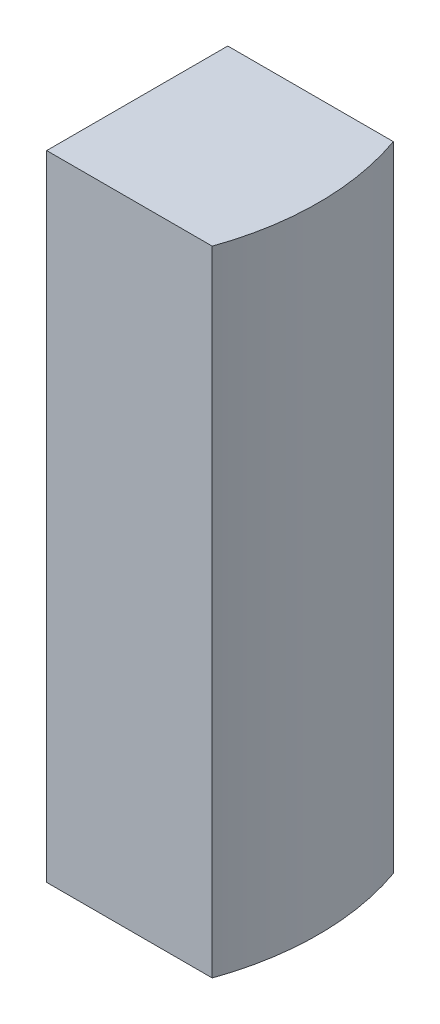
ISO-10303-21;
HEADER;
FILE_DESCRIPTION(('STEP AP214'),'2;1');
FILE_NAME('part.step','',(''),(''),'','','');
FILE_SCHEMA(('AUTOMOTIVE_DESIGN { 1 0 10303 214 1 1 1 1 }'));
ENDSEC;
DATA;
#1=APPLICATION_CONTEXT('core data for automotive mechanical design processes');
#2=APPLICATION_PROTOCOL_DEFINITION('international standard','automotive_design',2000,#1);
#3=PRODUCT_CONTEXT('',#1,'mechanical');
#4=PRODUCT('Part','Part','',(#3));
#5=PRODUCT_RELATED_PRODUCT_CATEGORY('part','',(#4));
#6=PRODUCT_DEFINITION_FORMATION('','',#4);
#7=PRODUCT_DEFINITION_CONTEXT('part definition',#1,'design');
#8=PRODUCT_DEFINITION('design','',#6,#7);
#9=PRODUCT_DEFINITION_SHAPE('','',#8);
#10=(LENGTH_UNIT() NAMED_UNIT(*) SI_UNIT(.MILLI.,.METRE.));
#11=(NAMED_UNIT(*) PLANE_ANGLE_UNIT() SI_UNIT($,.RADIAN.));
#12=(NAMED_UNIT(*) SI_UNIT($,.STERADIAN.) SOLID_ANGLE_UNIT());
#13=UNCERTAINTY_MEASURE_WITH_UNIT(LENGTH_MEASURE(1.E-05),#10,'distance_accuracy_value','');
#14=(GEOMETRIC_REPRESENTATION_CONTEXT(3) GLOBAL_UNCERTAINTY_ASSIGNED_CONTEXT((#13)) GLOBAL_UNIT_ASSIGNED_CONTEXT((#10,
#11,#12)) REPRESENTATION_CONTEXT('',''));
#15=CARTESIAN_POINT('',(0.,0.,0.));
#16=DIRECTION('',(0.,0.,1.));
#17=DIRECTION('',(1.,0.,0.));
#18=AXIS2_PLACEMENT_3D('',#15,#16,#17);
#19=CARTESIAN_POINT('',(0.,140.,20.));
#20=DIRECTION('',(0.,0.,-1.));
#21=DIRECTION('',(-1.,0.,0.));
#22=AXIS2_PLACEMENT_3D('',#19,#20,#21);
#23=PLANE('',#22);
#24=DIRECTION('',(1.,0.,0.));
#25=VECTOR('',#24,1.);
#26=CARTESIAN_POINT('',(0.,0.,20.));
#27=LINE('',#26,#25);
#28=CARTESIAN_POINT('',(20.,0.,20.));
#29=VERTEX_POINT('',#28);
#30=CARTESIAN_POINT('',(56.5685424949238,0.,20.));
#31=VERTEX_POINT('',#30);
#32=EDGE_CURVE('E99',#29,#31,#27,.T.);
#33=ORIENTED_EDGE('',*,*,#32,.T.);
#34=DIRECTION('',(0.,-1.,0.));
#35=VECTOR('',#34,1.);
#36=CARTESIAN_POINT('',(56.5685424949238,140.,20.));
#37=LINE('',#36,#35);
#38=CARTESIAN_POINT('',(56.5685424949238,140.,20.));
#39=VERTEX_POINT('',#38);
#40=EDGE_CURVE('E11',#39,#31,#37,.T.);
#41=ORIENTED_EDGE('',*,*,#40,.F.);
#42=DIRECTION('',(1.,0.,0.));
#43=VECTOR('',#42,1.);
#44=CARTESIAN_POINT('',(0.,140.,20.));
#45=LINE('',#44,#43);
#46=CARTESIAN_POINT('',(20.,140.,20.));
#47=VERTEX_POINT('',#46);
#48=EDGE_CURVE('E84',#47,#39,#45,.T.);
#49=ORIENTED_EDGE('',*,*,#48,.F.);
#50=DIRECTION('',(0.,-1.,0.));
#51=VECTOR('',#50,1.);
#52=CARTESIAN_POINT('',(20.,140.,20.));
#53=LINE('',#52,#51);
#54=EDGE_CURVE('E95',#47,#29,#53,.T.);
#55=ORIENTED_EDGE('',*,*,#54,.T.);
#56=EDGE_LOOP('',(#33,#41,#49,#55));
#57=FACE_BOUND('',#56,.T.);
#58=ADVANCED_FACE('F37',(#57),#23,.F.);
#59=CARTESIAN_POINT('',(0.,140.,0.));
#60=DIRECTION('',(0.,-1.,0.));
#61=DIRECTION('',(0.,0.,-1.));
#62=AXIS2_PLACEMENT_3D('',#59,#60,#61);
#63=CYLINDRICAL_SURFACE('',#62,60.);
#64=CARTESIAN_POINT('',(0.,0.,0.));
#65=DIRECTION('',(0.,1.,0.));
#66=DIRECTION('',(0.,0.,1.));
#67=AXIS2_PLACEMENT_3D('',#64,#65,#66);
#68=CIRCLE('',#67,60.);
#69=CARTESIAN_POINT('',(56.5685424949238,0.,-20.));
#70=VERTEX_POINT('',#69);
#71=EDGE_CURVE('E89',#31,#70,#68,.T.);
#72=ORIENTED_EDGE('',*,*,#71,.T.);
#73=DIRECTION('',(0.,-1.,0.));
#74=VECTOR('',#73,1.);
#75=CARTESIAN_POINT('',(56.5685424949238,140.,-20.));
#76=LINE('',#75,#74);
#77=CARTESIAN_POINT('',(56.5685424949238,140.,-20.));
#78=VERTEX_POINT('',#77);
#79=EDGE_CURVE('E45',#78,#70,#76,.T.);
#80=ORIENTED_EDGE('',*,*,#79,.F.);
#81=CARTESIAN_POINT('',(0.,140.,0.));
#82=DIRECTION('',(0.,1.,0.));
#83=DIRECTION('',(0.,0.,1.));
#84=AXIS2_PLACEMENT_3D('',#81,#82,#83);
#85=CIRCLE('',#84,60.);
#86=EDGE_CURVE('E79',#39,#78,#85,.T.);
#87=ORIENTED_EDGE('',*,*,#86,.F.);
#88=ORIENTED_EDGE('',*,*,#40,.T.);
#89=EDGE_LOOP('',(#72,#80,#87,#88));
#90=FACE_BOUND('',#89,.T.);
#91=ADVANCED_FACE('F88',(#90),#63,.T.);
#92=CARTESIAN_POINT('',(0.,140.,-20.));
#93=DIRECTION('',(0.,0.,-1.));
#94=DIRECTION('',(-1.,0.,0.));
#95=AXIS2_PLACEMENT_3D('',#92,#93,#94);
#96=PLANE('',#95);
#97=DIRECTION('',(1.,0.,0.));
#98=VECTOR('',#97,1.);
#99=CARTESIAN_POINT('',(0.,0.,-20.));
#100=LINE('',#99,#98);
#101=CARTESIAN_POINT('',(20.,0.,-20.));
#102=VERTEX_POINT('',#101);
#103=EDGE_CURVE('E103',#102,#70,#100,.T.);
#104=ORIENTED_EDGE('',*,*,#103,.F.);
#105=DIRECTION('',(0.,-1.,0.));
#106=VECTOR('',#105,1.);
#107=CARTESIAN_POINT('',(20.,140.,-20.));
#108=LINE('',#107,#106);
#109=CARTESIAN_POINT('',(20.,140.,-20.));
#110=VERTEX_POINT('',#109);
#111=EDGE_CURVE('E69',#110,#102,#108,.T.);
#112=ORIENTED_EDGE('',*,*,#111,.F.);
#113=DIRECTION('',(1.,0.,0.));
#114=VECTOR('',#113,1.);
#115=CARTESIAN_POINT('',(0.,140.,-20.));
#116=LINE('',#115,#114);
#117=EDGE_CURVE('E82',#110,#78,#116,.T.);
#118=ORIENTED_EDGE('',*,*,#117,.T.);
#119=ORIENTED_EDGE('',*,*,#79,.T.);
#120=EDGE_LOOP('',(#104,#112,#118,#119));
#121=FACE_BOUND('',#120,.T.);
#122=ADVANCED_FACE('F93',(#121),#96,.T.);
#123=CARTESIAN_POINT('',(20.,140.,0.));
#124=DIRECTION('',(1.,0.,0.));
#125=DIRECTION('',(0.,0.,-1.));
#126=AXIS2_PLACEMENT_3D('',#123,#124,#125);
#127=PLANE('',#126);
#128=DIRECTION('',(0.,0.,1.));
#129=VECTOR('',#128,1.);
#130=CARTESIAN_POINT('',(20.,0.,0.));
#131=LINE('',#130,#129);
#132=EDGE_CURVE('E72',#102,#29,#131,.T.);
#133=ORIENTED_EDGE('',*,*,#132,.T.);
#134=ORIENTED_EDGE('',*,*,#54,.F.);
#135=DIRECTION('',(0.,0.,1.));
#136=VECTOR('',#135,1.);
#137=CARTESIAN_POINT('',(20.,140.,0.));
#138=LINE('',#137,#136);
#139=EDGE_CURVE('E53',#110,#47,#138,.T.);
#140=ORIENTED_EDGE('',*,*,#139,.F.);
#141=ORIENTED_EDGE('',*,*,#111,.T.);
#142=EDGE_LOOP('',(#133,#134,#140,#141));
#143=FACE_BOUND('',#142,.T.);
#144=ADVANCED_FACE('F116',(#143),#127,.F.);
#145=CARTESIAN_POINT('',(0.,140.,0.));
#146=DIRECTION('',(0.,1.,0.));
#147=DIRECTION('',(0.,0.,1.));
#148=AXIS2_PLACEMENT_3D('',#145,#146,#147);
#149=PLANE('',#148);
#150=ORIENTED_EDGE('',*,*,#48,.T.);
#151=ORIENTED_EDGE('',*,*,#86,.T.);
#152=ORIENTED_EDGE('',*,*,#117,.F.);
#153=ORIENTED_EDGE('',*,*,#139,.T.);
#154=EDGE_LOOP('',(#150,#151,#152,#153));
#155=FACE_BOUND('',#154,.T.);
#156=ADVANCED_FACE('F80',(#155),#149,.T.);
#157=CARTESIAN_POINT('',(0.,0.,0.));
#158=DIRECTION('',(0.,1.,0.));
#159=DIRECTION('',(0.,0.,1.));
#160=AXIS2_PLACEMENT_3D('',#157,#158,#159);
#161=PLANE('',#160);
#162=ORIENTED_EDGE('',*,*,#32,.F.);
#163=ORIENTED_EDGE('',*,*,#132,.F.);
#164=ORIENTED_EDGE('',*,*,#103,.T.);
#165=ORIENTED_EDGE('',*,*,#71,.F.);
#166=EDGE_LOOP('',(#162,#163,#164,#165));
#167=FACE_BOUND('',#166,.T.);
#168=ADVANCED_FACE('F110',(#167),#161,.F.);
#169=CLOSED_SHELL('',(#58,#91,#122,#144,#156,#168));
#170=MANIFOLD_SOLID_BREP('B2',#169);
#171=ADVANCED_BREP_SHAPE_REPRESENTATION('',(#18,#170),#14);
#172=SHAPE_DEFINITION_REPRESENTATION(#9,#171);
ENDSEC;
END-ISO-10303-21;
